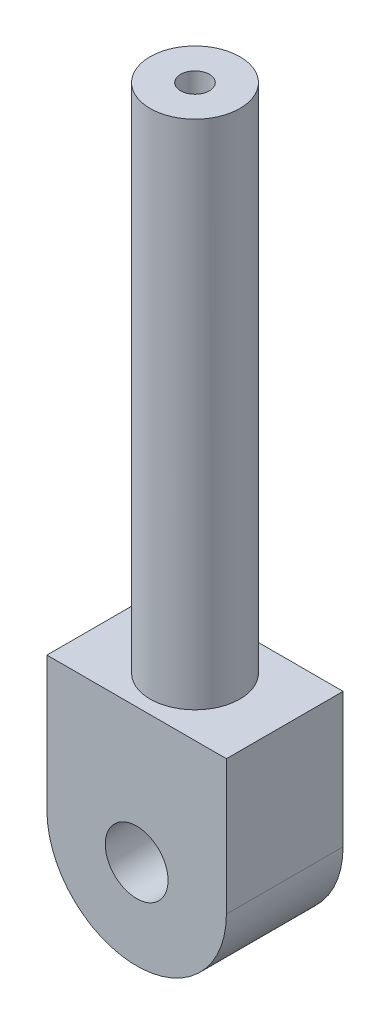
ISO-10303-21;
HEADER;
FILE_DESCRIPTION(('STEP AP214'),'2;1');
FILE_NAME('part.step','',(''),(''),'','','');
FILE_SCHEMA(('AUTOMOTIVE_DESIGN { 1 0 10303 214 1 1 1 1 }'));
ENDSEC;
DATA;
#1=APPLICATION_CONTEXT('core data for automotive mechanical design processes');
#2=APPLICATION_PROTOCOL_DEFINITION('international standard','automotive_design',2000,#1);
#3=PRODUCT_CONTEXT('',#1,'mechanical');
#4=PRODUCT('Part','Part','',(#3));
#5=PRODUCT_RELATED_PRODUCT_CATEGORY('part','',(#4));
#6=PRODUCT_DEFINITION_FORMATION('','',#4);
#7=PRODUCT_DEFINITION_CONTEXT('part definition',#1,'design');
#8=PRODUCT_DEFINITION('design','',#6,#7);
#9=PRODUCT_DEFINITION_SHAPE('','',#8);
#10=(LENGTH_UNIT() NAMED_UNIT(*) SI_UNIT(.MILLI.,.METRE.));
#11=(NAMED_UNIT(*) PLANE_ANGLE_UNIT() SI_UNIT($,.RADIAN.));
#12=(NAMED_UNIT(*) SI_UNIT($,.STERADIAN.) SOLID_ANGLE_UNIT());
#13=UNCERTAINTY_MEASURE_WITH_UNIT(LENGTH_MEASURE(1.E-05),#10,'distance_accuracy_value','');
#14=(GEOMETRIC_REPRESENTATION_CONTEXT(3) GLOBAL_UNCERTAINTY_ASSIGNED_CONTEXT((#13)) GLOBAL_UNIT_ASSIGNED_CONTEXT((#10,
#11,#12)) REPRESENTATION_CONTEXT('',''));
#15=CARTESIAN_POINT('',(0.,0.,0.));
#16=DIRECTION('',(0.,0.,1.));
#17=DIRECTION('',(1.,0.,0.));
#18=AXIS2_PLACEMENT_3D('',#15,#16,#17);
#19=CARTESIAN_POINT('',(10.,15.,13.));
#20=DIRECTION('',(0.,-1.,0.));
#21=DIRECTION('',(0.,0.,-1.));
#22=AXIS2_PLACEMENT_3D('',#19,#20,#21);
#23=PLANE('',#22);
#24=DIRECTION('',(-1.,0.,0.));
#25=VECTOR('',#24,1.);
#26=CARTESIAN_POINT('',(10.,15.,0.));
#27=LINE('',#26,#25);
#28=CARTESIAN_POINT('',(10.,15.,0.));
#29=VERTEX_POINT('',#28);
#30=CARTESIAN_POINT('',(-10.,15.,0.));
#31=VERTEX_POINT('',#30);
#32=EDGE_CURVE('E102',#29,#31,#27,.T.);
#33=ORIENTED_EDGE('',*,*,#32,.T.);
#34=DIRECTION('',(0.,0.,-1.));
#35=VECTOR('',#34,1.);
#36=CARTESIAN_POINT('',(-10.,15.,13.));
#37=LINE('',#36,#35);
#38=CARTESIAN_POINT('',(-10.,15.,13.));
#39=VERTEX_POINT('',#38);
#40=EDGE_CURVE('E43',#39,#31,#37,.T.);
#41=ORIENTED_EDGE('',*,*,#40,.F.);
#42=DIRECTION('',(-1.,0.,0.));
#43=VECTOR('',#42,1.);
#44=CARTESIAN_POINT('',(10.,15.,13.));
#45=LINE('',#44,#43);
#46=CARTESIAN_POINT('',(10.,15.,13.));
#47=VERTEX_POINT('',#46);
#48=EDGE_CURVE('E88',#47,#39,#45,.T.);
#49=ORIENTED_EDGE('',*,*,#48,.F.);
#50=DIRECTION('',(0.,0.,-1.));
#51=VECTOR('',#50,1.);
#52=CARTESIAN_POINT('',(10.,15.,13.));
#53=LINE('',#52,#51);
#54=EDGE_CURVE('E98',#47,#29,#53,.T.);
#55=ORIENTED_EDGE('',*,*,#54,.T.);
#56=EDGE_LOOP('',(#33,#41,#49,#55));
#57=FACE_BOUND('',#56,.T.);
#58=CARTESIAN_POINT('',(0.,15.,6.5));
#59=DIRECTION('',(0.,-1.,0.));
#60=DIRECTION('',(0.,0.,-1.));
#61=AXIS2_PLACEMENT_3D('',#58,#59,#60);
#62=CIRCLE('',#61,5.);
#63=CARTESIAN_POINT('',(0.,15.,1.5));
#64=VERTEX_POINT('',#63);
#65=EDGE_CURVE('E11',#64,#64,#62,.F.);
#66=ORIENTED_EDGE('',*,*,#65,.F.);
#67=EDGE_LOOP('',(#66));
#68=FACE_BOUND('',#67,.T.);
#69=ADVANCED_FACE('F35',(#57,#68),#23,.F.);
#70=CARTESIAN_POINT('',(0.,0.,13.));
#71=DIRECTION('',(0.,0.,1.));
#72=DIRECTION('',(1.,0.,0.));
#73=AXIS2_PLACEMENT_3D('',#70,#71,#72);
#74=PLANE('',#73);
#75=ORIENTED_EDGE('',*,*,#48,.T.);
#76=DIRECTION('',(0.,-1.,0.));
#77=VECTOR('',#76,1.);
#78=CARTESIAN_POINT('',(-10.,0.,13.));
#79=LINE('',#78,#77);
#80=CARTESIAN_POINT('',(-10.,0.,13.));
#81=VERTEX_POINT('',#80);
#82=EDGE_CURVE('E82',#39,#81,#79,.T.);
#83=ORIENTED_EDGE('',*,*,#82,.T.);
#84=CARTESIAN_POINT('',(0.,0.,13.));
#85=DIRECTION('',(0.,0.,1.));
#86=DIRECTION('',(1.,0.,0.));
#87=AXIS2_PLACEMENT_3D('',#84,#85,#86);
#88=CIRCLE('',#87,10.);
#89=CARTESIAN_POINT('',(10.,0.,13.));
#90=VERTEX_POINT('',#89);
#91=EDGE_CURVE('E86',#81,#90,#88,.T.);
#92=ORIENTED_EDGE('',*,*,#91,.T.);
#93=DIRECTION('',(0.,1.,0.));
#94=VECTOR('',#93,1.);
#95=CARTESIAN_POINT('',(10.,0.,13.));
#96=LINE('',#95,#94);
#97=EDGE_CURVE('E51',#90,#47,#96,.T.);
#98=ORIENTED_EDGE('',*,*,#97,.T.);
#99=EDGE_LOOP('',(#75,#83,#92,#98));
#100=FACE_BOUND('',#99,.T.);
#101=CARTESIAN_POINT('',(0.,0.,13.));
#102=DIRECTION('',(0.,0.,1.));
#103=DIRECTION('',(1.,0.,0.));
#104=AXIS2_PLACEMENT_3D('',#101,#102,#103);
#105=CIRCLE('',#104,3.5);
#106=CARTESIAN_POINT('',(-3.5,0.,13.));
#107=VERTEX_POINT('',#106);
#108=EDGE_CURVE('E105',#107,#107,#105,.T.);
#109=ORIENTED_EDGE('',*,*,#108,.F.);
#110=EDGE_LOOP('',(#109));
#111=FACE_BOUND('',#110,.T.);
#112=ADVANCED_FACE('F83',(#100,#111),#74,.T.);
#113=CARTESIAN_POINT('',(0.,0.,0.));
#114=DIRECTION('',(0.,0.,1.));
#115=DIRECTION('',(1.,0.,0.));
#116=AXIS2_PLACEMENT_3D('',#113,#114,#115);
#117=PLANE('',#116);
#118=ORIENTED_EDGE('',*,*,#32,.F.);
#119=DIRECTION('',(0.,1.,0.));
#120=VECTOR('',#119,1.);
#121=CARTESIAN_POINT('',(10.,0.,0.));
#122=LINE('',#121,#120);
#123=CARTESIAN_POINT('',(10.,0.,0.));
#124=VERTEX_POINT('',#123);
#125=EDGE_CURVE('E74',#124,#29,#122,.T.);
#126=ORIENTED_EDGE('',*,*,#125,.F.);
#127=CARTESIAN_POINT('',(0.,0.,0.));
#128=DIRECTION('',(0.,0.,1.));
#129=DIRECTION('',(1.,0.,0.));
#130=AXIS2_PLACEMENT_3D('',#127,#128,#129);
#131=CIRCLE('',#130,10.);
#132=CARTESIAN_POINT('',(-10.,0.,0.));
#133=VERTEX_POINT('',#132);
#134=EDGE_CURVE('E68',#133,#124,#131,.T.);
#135=ORIENTED_EDGE('',*,*,#134,.F.);
#136=DIRECTION('',(0.,-1.,0.));
#137=VECTOR('',#136,1.);
#138=CARTESIAN_POINT('',(-10.,0.,0.));
#139=LINE('',#138,#137);
#140=EDGE_CURVE('E93',#31,#133,#139,.T.);
#141=ORIENTED_EDGE('',*,*,#140,.F.);
#142=EDGE_LOOP('',(#118,#126,#135,#141));
#143=FACE_BOUND('',#142,.T.);
#144=CARTESIAN_POINT('',(0.,0.,0.));
#145=DIRECTION('',(0.,0.,1.));
#146=DIRECTION('',(1.,0.,0.));
#147=AXIS2_PLACEMENT_3D('',#144,#145,#146);
#148=CIRCLE('',#147,3.5);
#149=CARTESIAN_POINT('',(-3.5,0.,0.));
#150=VERTEX_POINT('',#149);
#151=EDGE_CURVE('E120',#150,#150,#148,.T.);
#152=ORIENTED_EDGE('',*,*,#151,.T.);
#153=EDGE_LOOP('',(#152));
#154=FACE_BOUND('',#153,.T.);
#155=ADVANCED_FACE('F114',(#143,#154),#117,.F.);
#156=CARTESIAN_POINT('',(-10.,0.,13.));
#157=DIRECTION('',(1.,0.,0.));
#158=DIRECTION('',(0.,1.,0.));
#159=AXIS2_PLACEMENT_3D('',#156,#157,#158);
#160=PLANE('',#159);
#161=ORIENTED_EDGE('',*,*,#140,.T.);
#162=DIRECTION('',(0.,0.,-1.));
#163=VECTOR('',#162,1.);
#164=CARTESIAN_POINT('',(-10.,0.,13.));
#165=LINE('',#164,#163);
#166=EDGE_CURVE('E91',#81,#133,#165,.T.);
#167=ORIENTED_EDGE('',*,*,#166,.F.);
#168=ORIENTED_EDGE('',*,*,#82,.F.);
#169=ORIENTED_EDGE('',*,*,#40,.T.);
#170=EDGE_LOOP('',(#161,#167,#168,#169));
#171=FACE_BOUND('',#170,.T.);
#172=ADVANCED_FACE('F92',(#171),#160,.F.);
#173=CARTESIAN_POINT('',(0.,0.,13.));
#174=DIRECTION('',(0.,0.,-1.));
#175=DIRECTION('',(-1.,0.,0.));
#176=AXIS2_PLACEMENT_3D('',#173,#174,#175);
#177=CYLINDRICAL_SURFACE('',#176,10.);
#178=ORIENTED_EDGE('',*,*,#134,.T.);
#179=DIRECTION('',(0.,0.,-1.));
#180=VECTOR('',#179,1.);
#181=CARTESIAN_POINT('',(10.,0.,13.));
#182=LINE('',#181,#180);
#183=EDGE_CURVE('E94',#90,#124,#182,.T.);
#184=ORIENTED_EDGE('',*,*,#183,.F.);
#185=ORIENTED_EDGE('',*,*,#91,.F.);
#186=ORIENTED_EDGE('',*,*,#166,.T.);
#187=EDGE_LOOP('',(#178,#184,#185,#186));
#188=FACE_BOUND('',#187,.T.);
#189=ADVANCED_FACE('F96',(#188),#177,.T.);
#190=CARTESIAN_POINT('',(10.,0.,13.));
#191=DIRECTION('',(-1.,0.,0.));
#192=DIRECTION('',(0.,0.,1.));
#193=AXIS2_PLACEMENT_3D('',#190,#191,#192);
#194=PLANE('',#193);
#195=ORIENTED_EDGE('',*,*,#125,.T.);
#196=ORIENTED_EDGE('',*,*,#54,.F.);
#197=ORIENTED_EDGE('',*,*,#97,.F.);
#198=ORIENTED_EDGE('',*,*,#183,.T.);
#199=EDGE_LOOP('',(#195,#196,#197,#198));
#200=FACE_BOUND('',#199,.T.);
#201=ADVANCED_FACE('F165',(#200),#194,.F.);
#202=CARTESIAN_POINT('',(0.,0.,13.));
#203=DIRECTION('',(0.,0.,-1.));
#204=DIRECTION('',(-1.,0.,0.));
#205=AXIS2_PLACEMENT_3D('',#202,#203,#204);
#206=CYLINDRICAL_SURFACE('',#205,3.5);
#207=CARTESIAN_POINT('',(-3.5,0.,13.));
#208=CARTESIAN_POINT('',(-3.5,0.,12.8645833333333));
#209=CARTESIAN_POINT('',(-3.5,0.,12.7291666666667));
#210=CARTESIAN_POINT('',(-3.5,0.,12.4583333333333));
#211=CARTESIAN_POINT('',(-3.5,0.,12.3229166666667));
#212=CARTESIAN_POINT('',(-3.5,0.,12.0520833333333));
#213=CARTESIAN_POINT('',(-3.5,0.,11.9166666666667));
#214=CARTESIAN_POINT('',(-3.5,0.,11.6458333333333));
#215=CARTESIAN_POINT('',(-3.5,0.,11.5104166666667));
#216=CARTESIAN_POINT('',(-3.5,0.,11.2395833333333));
#217=CARTESIAN_POINT('',(-3.5,0.,11.1041666666667));
#218=CARTESIAN_POINT('',(-3.5,0.,10.8333333333333));
#219=CARTESIAN_POINT('',(-3.5,0.,10.6979166666667));
#220=CARTESIAN_POINT('',(-3.5,0.,10.4270833333333));
#221=CARTESIAN_POINT('',(-3.5,0.,10.2916666666667));
#222=CARTESIAN_POINT('',(-3.5,0.,10.0208333333333));
#223=CARTESIAN_POINT('',(-3.5,0.,9.88541666666667));
#224=CARTESIAN_POINT('',(-3.5,0.,9.61458333333333));
#225=CARTESIAN_POINT('',(-3.5,0.,9.47916666666667));
#226=CARTESIAN_POINT('',(-3.5,0.,9.20833333333333));
#227=CARTESIAN_POINT('',(-3.5,0.,9.07291666666667));
#228=CARTESIAN_POINT('',(-3.5,0.,8.80208333333333));
#229=CARTESIAN_POINT('',(-3.5,0.,8.66666666666667));
#230=CARTESIAN_POINT('',(-3.5,0.,8.39583333333333));
#231=CARTESIAN_POINT('',(-3.5,0.,8.26041666666667));
#232=CARTESIAN_POINT('',(-3.5,0.,7.98958333333333));
#233=CARTESIAN_POINT('',(-3.5,0.,7.85416666666667));
#234=CARTESIAN_POINT('',(-3.5,0.,7.58333333333333));
#235=CARTESIAN_POINT('',(-3.5,0.,7.44791666666667));
#236=CARTESIAN_POINT('',(-3.5,0.,7.17708333333333));
#237=CARTESIAN_POINT('',(-3.5,0.,7.04166666666667));
#238=CARTESIAN_POINT('',(-3.5,0.,6.77083333333333));
#239=CARTESIAN_POINT('',(-3.5,0.,6.63541666666667));
#240=CARTESIAN_POINT('',(-3.5,0.,6.36458333333333));
#241=CARTESIAN_POINT('',(-3.5,0.,6.22916666666667));
#242=CARTESIAN_POINT('',(-3.5,0.,5.95833333333333));
#243=CARTESIAN_POINT('',(-3.5,0.,5.82291666666667));
#244=CARTESIAN_POINT('',(-3.5,0.,5.55208333333333));
#245=CARTESIAN_POINT('',(-3.5,0.,5.41666666666667));
#246=CARTESIAN_POINT('',(-3.5,0.,5.14583333333333));
#247=CARTESIAN_POINT('',(-3.5,0.,5.01041666666667));
#248=CARTESIAN_POINT('',(-3.5,0.,4.73958333333333));
#249=CARTESIAN_POINT('',(-3.5,0.,4.60416666666667));
#250=CARTESIAN_POINT('',(-3.5,0.,4.33333333333333));
#251=CARTESIAN_POINT('',(-3.5,0.,4.19791666666667));
#252=CARTESIAN_POINT('',(-3.5,0.,3.92708333333333));
#253=CARTESIAN_POINT('',(-3.5,0.,3.79166666666667));
#254=CARTESIAN_POINT('',(-3.5,0.,3.52083333333333));
#255=CARTESIAN_POINT('',(-3.5,0.,3.38541666666667));
#256=CARTESIAN_POINT('',(-3.5,0.,3.11458333333333));
#257=CARTESIAN_POINT('',(-3.5,0.,2.97916666666667));
#258=CARTESIAN_POINT('',(-3.5,0.,2.70833333333333));
#259=CARTESIAN_POINT('',(-3.5,0.,2.57291666666667));
#260=CARTESIAN_POINT('',(-3.5,0.,2.30208333333333));
#261=CARTESIAN_POINT('',(-3.5,0.,2.16666666666667));
#262=CARTESIAN_POINT('',(-3.5,0.,1.89583333333333));
#263=CARTESIAN_POINT('',(-3.5,0.,1.76041666666667));
#264=CARTESIAN_POINT('',(-3.5,0.,1.48958333333333));
#265=CARTESIAN_POINT('',(-3.5,0.,1.35416666666667));
#266=CARTESIAN_POINT('',(-3.5,0.,1.08333333333333));
#267=CARTESIAN_POINT('',(-3.5,0.,0.947916666666667));
#268=CARTESIAN_POINT('',(-3.5,0.,0.677083333333334));
#269=CARTESIAN_POINT('',(-3.5,0.,0.541666666666667));
#270=CARTESIAN_POINT('',(-3.5,0.,0.270833333333334));
#271=CARTESIAN_POINT('',(-3.5,0.,0.135416666666667));
#272=CARTESIAN_POINT('',(-3.5,0.,0.));
#273=B_SPLINE_CURVE_WITH_KNOTS('',3,(#207,#208,#209,#210,#211,#212,#213,#214,#215,#216,#217,
#218,#219,#220,#221,#222,#223,#224,#225,#226,#227,#228,#229,#230,#231,#232,#233,#234,#235,#236,
#237,#238,#239,#240,#241,#242,#243,#244,#245,#246,#247,#248,#249,#250,#251,#252,#253,#254,#255,
#256,#257,#258,#259,#260,#261,#262,#263,#264,#265,#266,#267,#268,#269,#270,#271,#272),
.UNSPECIFIED.,.F.,.F.,(4,2,2,2,2,2,2,2,2,2,2,2,2,2,2,2,2,2,2,2,2,2,2,2,2,2,2,2,2,2,2,2,4),(0.,
0.406249999999999,0.812499999999999,1.21875,1.625,2.03125,2.4375,2.84375,3.25,3.65625,4.0625,
4.46875,4.875,5.28125,5.6875,6.09375,6.5,6.90625,7.3125,7.71875,8.125,8.53125,8.9375,9.34375,
9.75,10.15625,10.5625,10.96875,11.375,11.78125,12.1875,12.59375,13.),.UNSPECIFIED.);
#274=EDGE_CURVE('BSEAM153',#107,#150,#273,.T.);
#275=ORIENTED_EDGE('',*,*,#108,.T.);
#276=ORIENTED_EDGE('',*,*,#151,.F.);
#277=ORIENTED_EDGE('',*,*,#274,.T.);
#278=ORIENTED_EDGE('',*,*,#274,.F.);
#279=EDGE_LOOP('',(#275,#277,#276,#278));
#280=FACE_BOUND('',#279,.T.);
#281=ADVANCED_FACE('F153',(#280),#206,.F.);
#282=CARTESIAN_POINT('',(0.,72.,6.5));
#283=DIRECTION('',(0.,-1.,0.));
#284=DIRECTION('',(1.,0.,0.));
#285=AXIS2_PLACEMENT_3D('',#282,#283,#284);
#286=CYLINDRICAL_SURFACE('',#285,5.);
#287=CARTESIAN_POINT('',(0.,72.,6.5));
#288=DIRECTION('',(0.,1.,0.));
#289=DIRECTION('',(-1.,0.,0.));
#290=AXIS2_PLACEMENT_3D('',#287,#288,#289);
#291=CIRCLE('',#290,5.);
#292=CARTESIAN_POINT('',(-5.00000000000002,72.,6.5));
#293=VERTEX_POINT('',#292);
#294=EDGE_CURVE('E122',#293,#293,#291,.T.);
#295=ORIENTED_EDGE('',*,*,#294,.F.);
#296=EDGE_LOOP('',(#295));
#297=FACE_BOUND('',#296,.T.);
#298=ORIENTED_EDGE('',*,*,#65,.T.);
#299=EDGE_LOOP('',(#298));
#300=FACE_BOUND('',#299,.T.);
#301=ADVANCED_FACE('F147',(#297,#300),#286,.T.);
#302=CARTESIAN_POINT('',(0.,72.,6.5));
#303=DIRECTION('',(0.,1.,0.));
#304=DIRECTION('',(-1.,0.,0.));
#305=AXIS2_PLACEMENT_3D('',#302,#303,#304);
#306=PLANE('',#305);
#307=CARTESIAN_POINT('',(0.,72.,6.5));
#308=DIRECTION('',(0.,1.,0.));
#309=DIRECTION('',(-1.,0.,0.));
#310=AXIS2_PLACEMENT_3D('',#307,#308,#309);
#311=CIRCLE('',#310,1.6);
#312=CARTESIAN_POINT('',(-1.60000000000001,72.,6.5));
#313=VERTEX_POINT('',#312);
#314=EDGE_CURVE('E130',#313,#313,#311,.T.);
#315=ORIENTED_EDGE('',*,*,#314,.F.);
#316=EDGE_LOOP('',(#315));
#317=FACE_BOUND('',#316,.T.);
#318=ORIENTED_EDGE('',*,*,#294,.T.);
#319=EDGE_LOOP('',(#318));
#320=FACE_BOUND('',#319,.T.);
#321=ADVANCED_FACE('F141',(#317,#320),#306,.T.);
#322=CARTESIAN_POINT('',(0.,38.,6.5));
#323=DIRECTION('',(0.,1.,0.));
#324=DIRECTION('',(-1.,0.,0.));
#325=AXIS2_PLACEMENT_3D('',#322,#323,#324);
#326=CYLINDRICAL_SURFACE('',#325,1.6);
#327=CARTESIAN_POINT('',(0.,38.,6.5));
#328=DIRECTION('',(0.,1.,0.));
#329=DIRECTION('',(-1.,0.,0.));
#330=AXIS2_PLACEMENT_3D('',#327,#328,#329);
#331=CIRCLE('',#330,1.6);
#332=CARTESIAN_POINT('',(-1.6,38.,6.5));
#333=VERTEX_POINT('',#332);
#334=EDGE_CURVE('E127',#333,#333,#331,.T.);
#335=ORIENTED_EDGE('',*,*,#334,.F.);
#336=EDGE_LOOP('',(#335));
#337=FACE_BOUND('',#336,.T.);
#338=ORIENTED_EDGE('',*,*,#314,.T.);
#339=EDGE_LOOP('',(#338));
#340=FACE_BOUND('',#339,.T.);
#341=ADVANCED_FACE('F138',(#337,#340),#326,.F.);
#342=CARTESIAN_POINT('',(0.,38.,6.5));
#343=DIRECTION('',(0.,1.,0.));
#344=DIRECTION('',(-1.,0.,0.));
#345=AXIS2_PLACEMENT_3D('',#342,#343,#344);
#346=PLANE('',#345);
#347=ORIENTED_EDGE('',*,*,#334,.T.);
#348=EDGE_LOOP('',(#347));
#349=FACE_BOUND('',#348,.T.);
#350=ADVANCED_FACE('F136',(#349),#346,.T.);
#351=CLOSED_SHELL('',(#69,#112,#155,#172,#189,#201,#281,#301,#321,#341,#350));
#352=MANIFOLD_SOLID_BREP('B2',#351);
#353=ADVANCED_BREP_SHAPE_REPRESENTATION('',(#18,#352),#14);
#354=SHAPE_DEFINITION_REPRESENTATION(#9,#353);
ENDSEC;
END-ISO-10303-21;
